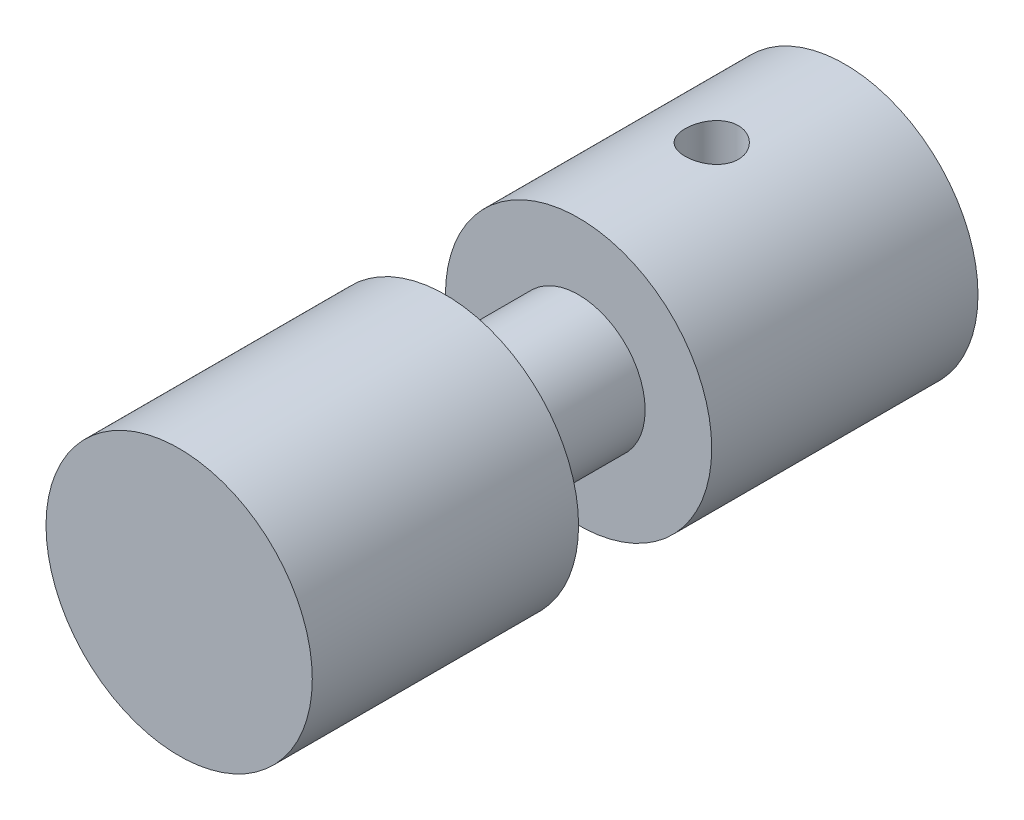
ISO-10303-21;
HEADER;
FILE_DESCRIPTION(('STEP AP214'),'2;1');
FILE_NAME('part.step','',(''),(''),'','','');
FILE_SCHEMA(('AUTOMOTIVE_DESIGN { 1 0 10303 214 1 1 1 1 }'));
ENDSEC;
DATA;
#1=APPLICATION_CONTEXT('core data for automotive mechanical design processes');
#2=APPLICATION_PROTOCOL_DEFINITION('international standard','automotive_design',2000,#1);
#3=PRODUCT_CONTEXT('',#1,'mechanical');
#4=PRODUCT('Part','Part','',(#3));
#5=PRODUCT_RELATED_PRODUCT_CATEGORY('part','',(#4));
#6=PRODUCT_DEFINITION_FORMATION('','',#4);
#7=PRODUCT_DEFINITION_CONTEXT('part definition',#1,'design');
#8=PRODUCT_DEFINITION('design','',#6,#7);
#9=PRODUCT_DEFINITION_SHAPE('','',#8);
#10=(LENGTH_UNIT() NAMED_UNIT(*) SI_UNIT(.MILLI.,.METRE.));
#11=(NAMED_UNIT(*) PLANE_ANGLE_UNIT() SI_UNIT($,.RADIAN.));
#12=(NAMED_UNIT(*) SI_UNIT($,.STERADIAN.) SOLID_ANGLE_UNIT());
#13=UNCERTAINTY_MEASURE_WITH_UNIT(LENGTH_MEASURE(1.E-05),#10,'distance_accuracy_value','');
#14=(GEOMETRIC_REPRESENTATION_CONTEXT(3) GLOBAL_UNCERTAINTY_ASSIGNED_CONTEXT((#13)) GLOBAL_UNIT_ASSIGNED_CONTEXT((#10,
#11,#12)) REPRESENTATION_CONTEXT('',''));
#15=CARTESIAN_POINT('',(0.,0.,0.));
#16=DIRECTION('',(0.,0.,1.));
#17=DIRECTION('',(1.,0.,0.));
#18=AXIS2_PLACEMENT_3D('',#15,#16,#17);
#19=CARTESIAN_POINT('',(0.,0.,10.));
#20=DIRECTION('',(0.,0.,-1.));
#21=DIRECTION('',(-1.,0.,0.));
#22=AXIS2_PLACEMENT_3D('',#19,#20,#21);
#23=CYLINDRICAL_SURFACE('',#22,5.);
#24=CARTESIAN_POINT('',(0.,-5.,6.));
#25=CARTESIAN_POINT('',(0.0555769067926331,-4.99999897580871,5.99999795550166));
#26=CARTESIAN_POINT('',(0.111179660201522,-4.99906385178231,5.99535115703235));
#27=CARTESIAN_POINT('',(0.220813507689019,-4.99542365623231,5.97690149988475));
#28=CARTESIAN_POINT('',(0.274843317541356,-4.99271717860186,5.96309136719849));
#29=CARTESIAN_POINT('',(0.379730305263313,-4.98583649278287,5.92675872637921));
#30=CARTESIAN_POINT('',(0.430590467933134,-4.98166369076718,5.90424456315531));
#31=CARTESIAN_POINT('',(0.527807988864225,-4.97230398035314,5.85116775248871));
#32=CARTESIAN_POINT('',(0.574165615075812,-4.96711713235707,5.8206055843928));
#33=CARTESIAN_POINT('',(0.661693477314865,-4.9562216532997,5.75186150570857));
#34=CARTESIAN_POINT('',(0.702793951158524,-4.95050745504347,5.7135916446088));
#35=CARTESIAN_POINT('',(0.778036756608028,-4.93924180452588,5.6307075836083));
#36=CARTESIAN_POINT('',(0.812178544770424,-4.93369036500424,5.58609288866488));
#37=CARTESIAN_POINT('',(0.87283175334762,-4.92332441812615,5.49128380698813));
#38=CARTESIAN_POINT('',(0.899270938865866,-4.91851707364946,5.44104235620364));
#39=CARTESIAN_POINT('',(0.943305666580308,-4.91026268058418,5.33671818099592));
#40=CARTESIAN_POINT('',(0.960902082437238,-4.90681549761962,5.28263583665366));
#41=CARTESIAN_POINT('',(0.986525299884827,-4.90172805252204,5.17291563609208));
#42=CARTESIAN_POINT('',(0.994674497958777,-4.90006470107188,5.11730745585777));
#43=CARTESIAN_POINT('',(1.00155212772612,-4.89866375060627,5.00549017863566));
#44=CARTESIAN_POINT('',(1.0002815227135,-4.89892595467841,4.94928114367985));
#45=CARTESIAN_POINT('',(0.988454573101819,-4.90132551148185,4.838753211979));
#46=CARTESIAN_POINT('',(0.978038540243905,-4.90343452858763,4.78441859437269));
#47=CARTESIAN_POINT('',(0.94843788462305,-4.90924546160001,4.678283923337));
#48=CARTESIAN_POINT('',(0.929252843100681,-4.91294745357779,4.62648399108099));
#49=CARTESIAN_POINT('',(0.88252478367472,-4.92155618500408,4.5264847382964));
#50=CARTESIAN_POINT('',(0.854926151232114,-4.92647089813704,4.47831212043083));
#51=CARTESIAN_POINT('',(0.792193574572679,-4.93694618773062,4.38722915002719));
#52=CARTESIAN_POINT('',(0.757058764356829,-4.94250683838366,4.34431940314884));
#53=CARTESIAN_POINT('',(0.679499934560584,-4.95377021241462,4.26417059754306));
#54=CARTESIAN_POINT('',(0.636956161212445,-4.95947369210905,4.22704743214087));
#55=CARTESIAN_POINT('',(0.54618502406201,-4.97028848714408,4.16044615369878));
#56=CARTESIAN_POINT('',(0.497957587379389,-4.97539979488974,4.13096813870642));
#57=CARTESIAN_POINT('',(0.397059386878921,-4.98446690160887,4.08047249077402));
#58=CARTESIAN_POINT('',(0.3443818195853,-4.98842088848272,4.05946810635546));
#59=CARTESIAN_POINT('',(0.236148976448665,-4.99471408987858,4.02663952596143));
#60=CARTESIAN_POINT('',(0.18059405007245,-4.99705350000531,4.01481421792637));
#61=CARTESIAN_POINT('',(0.0691794056271508,-4.99982671866868,4.00084354620572));
#62=CARTESIAN_POINT('',(0.0133403283255765,-5.0002917465247,3.99853958045973));
#63=CARTESIAN_POINT('',(-0.0979249341927137,-4.99935051930103,4.00324985894218));
#64=CARTESIAN_POINT('',(-0.153351142443793,-4.99794436941446,4.0102635793526));
#65=CARTESIAN_POINT('',(-0.26170565994654,-4.99343832008018,4.03327837354396));
#66=CARTESIAN_POINT('',(-0.314651948339903,-4.99035376404206,4.0491980684979));
#67=CARTESIAN_POINT('',(-0.417123627499667,-4.98283552061033,4.08948398265581));
#68=CARTESIAN_POINT('',(-0.466648761637539,-4.97840173214227,4.11385083467683));
#69=CARTESIAN_POINT('',(-0.561541173686218,-4.96859911533294,4.17068249065131));
#70=CARTESIAN_POINT('',(-0.606850126752188,-4.96321950437052,4.20324278103895));
#71=CARTESIAN_POINT('',(-0.691418019119207,-4.95214734829882,4.27540919120728));
#72=CARTESIAN_POINT('',(-0.730676308930762,-4.94645476968388,4.31501606639987));
#73=CARTESIAN_POINT('',(-0.802640590774176,-4.93529303556965,4.40087335189112));
#74=CARTESIAN_POINT('',(-0.835237702448655,-4.92982860233304,4.44721574422134));
#75=CARTESIAN_POINT('',(-0.892185420051205,-4.91984191796194,4.54481136135668));
#76=CARTESIAN_POINT('',(-0.916536355922902,-4.91531962913342,4.59606438957355));
#77=CARTESIAN_POINT('',(-0.95615184158196,-4.90776740584383,4.70176824614955));
#78=CARTESIAN_POINT('',(-0.971463499791051,-4.90472974872187,4.75620084121032));
#79=CARTESIAN_POINT('',(-0.992708651627196,-4.90047436792025,4.8669334534909));
#80=CARTESIAN_POINT('',(-0.998643368225112,-4.89925640691111,4.92323322620935));
#81=CARTESIAN_POINT('',(-1.00092091086747,-4.89879149631379,5.03500886454432));
#82=CARTESIAN_POINT('',(-0.997435788070896,-4.89950919189301,5.09048114892701));
#83=CARTESIAN_POINT('',(-0.981352304100061,-4.90275573484614,5.20003164990503));
#84=CARTESIAN_POINT('',(-0.968754016129298,-4.90528456767169,5.2541098776948));
#85=CARTESIAN_POINT('',(-0.934878568498954,-4.91185264219159,5.35922771124055));
#86=CARTESIAN_POINT('',(-0.913622506717345,-4.91588821018831,5.41027436050242));
#87=CARTESIAN_POINT('',(-0.863054644601604,-4.9250171497417,5.50810372073444));
#88=CARTESIAN_POINT('',(-0.833742168774882,-4.93011060998894,5.55488607372514));
#89=CARTESIAN_POINT('',(-0.767305914786414,-4.94088960523225,5.64371557215031));
#90=CARTESIAN_POINT('',(-0.730057887235181,-4.94658372909699,5.6856687652676));
#91=CARTESIAN_POINT('',(-0.649064369013141,-4.95786081871955,5.76278620552917));
#92=CARTESIAN_POINT('',(-0.605317387153335,-4.96344375863184,5.79794889031727));
#93=CARTESIAN_POINT('',(-0.512017629088246,-4.97393832387971,5.86083464394645));
#94=CARTESIAN_POINT('',(-0.462408884429834,-4.97884231219246,5.88847600328002));
#95=CARTESIAN_POINT('',(-0.359166360940732,-4.98735125085,5.93498612259659));
#96=CARTESIAN_POINT('',(-0.305536260863126,-4.99095737138616,5.95386278953249));
#97=CARTESIAN_POINT('',(-0.209821488923779,-4.99576372595371,5.97865194804472));
#98=CARTESIAN_POINT('',(-0.168281664013784,-4.99734303158452,5.98664319370776));
#99=CARTESIAN_POINT('',(-0.0844995252100669,-4.99946154139893,5.99731791235836));
#100=CARTESIAN_POINT('',(-0.042257233748619,-5.00000077873155,6.00000155450977));
#101=CARTESIAN_POINT('',(0.,-5.,6.));
#102=B_SPLINE_CURVE_WITH_KNOTS('',3,(#24,#25,#26,#27,#28,#29,#30,#31,#32,#33,#34,#35,#36,#37,
#38,#39,#40,#41,#42,#43,#44,#45,#46,#47,#48,#49,#50,#51,#52,#53,#54,#55,#56,#57,#58,#59,#60,#61,
#62,#63,#64,#65,#66,#67,#68,#69,#70,#71,#72,#73,#74,#75,#76,#77,#78,#79,#80,#81,#82,#83,#84,#85,
#86,#87,#88,#89,#90,#91,#92,#93,#94,#95,#96,#97,#98,#99,#100,#101),.UNSPECIFIED.,.T.,.F.,(4,2,2,
2,2,2,2,2,2,2,2,2,2,2,2,2,2,2,2,2,2,2,2,2,2,2,2,2,2,2,2,2,2,2,2,2,2,2,4),(0.,0.166576130661258,
0.333284650691323,0.499833735250341,0.666372902230863,0.834932670112185,1.00350559674737,
1.17361195005923,1.34370149365197,1.51156185103587,1.67940504281225,1.84471727006278,
2.0100373925373,2.17647490203593,2.3429315474967,2.51238252491351,2.6818356753982,
2.85155274854024,3.02124925698036,3.18810735676265,3.35495607657868,3.52030453950723,
3.68566539216022,3.85305066033359,4.0204538834593,4.19040628579226,4.36035188723466,
4.52940381032723,4.69843368330415,4.86439722567701,5.03035943492608,5.1959196125311,
5.36149367581867,5.52988076239143,5.69830654532931,5.86849496675637,6.03852955517519,
6.16518775289894,6.29184191370996),.UNSPECIFIED.);
#103=CARTESIAN_POINT('',(0.,-5.,6.));
#104=VERTEX_POINT('',#103);
#105=EDGE_CURVE('E81',#104,#104,#102,.T.);
#106=ORIENTED_EDGE('',*,*,#105,.T.);
#107=EDGE_LOOP('',(#106));
#108=FACE_BOUND('',#107,.T.);
#109=CARTESIAN_POINT('',(0.,5.,6.));
#110=CARTESIAN_POINT('',(-0.0555769067926331,4.99999897580871,5.99999795550166));
#111=CARTESIAN_POINT('',(-0.111179660201522,4.99906385178231,5.99535115703235));
#112=CARTESIAN_POINT('',(-0.220813507689019,4.99542365623231,5.97690149988475));
#113=CARTESIAN_POINT('',(-0.274843317541356,4.99271717860186,5.96309136719849));
#114=CARTESIAN_POINT('',(-0.379730305263313,4.98583649278287,5.92675872637921));
#115=CARTESIAN_POINT('',(-0.430590467933134,4.98166369076718,5.90424456315531));
#116=CARTESIAN_POINT('',(-0.527807988864225,4.97230398035314,5.85116775248871));
#117=CARTESIAN_POINT('',(-0.574165615075812,4.96711713235707,5.8206055843928));
#118=CARTESIAN_POINT('',(-0.661693477314865,4.9562216532997,5.75186150570857));
#119=CARTESIAN_POINT('',(-0.702793951158524,4.95050745504347,5.7135916446088));
#120=CARTESIAN_POINT('',(-0.778036756608028,4.93924180452588,5.6307075836083));
#121=CARTESIAN_POINT('',(-0.812178544770424,4.93369036500424,5.58609288866488));
#122=CARTESIAN_POINT('',(-0.87283175334762,4.92332441812615,5.49128380698813));
#123=CARTESIAN_POINT('',(-0.899270938865866,4.91851707364946,5.44104235620364));
#124=CARTESIAN_POINT('',(-0.943305666580308,4.91026268058418,5.33671818099592));
#125=CARTESIAN_POINT('',(-0.960902082437238,4.90681549761962,5.28263583665366));
#126=CARTESIAN_POINT('',(-0.986525299884827,4.90172805252204,5.17291563609208));
#127=CARTESIAN_POINT('',(-0.994674497958777,4.90006470107188,5.11730745585777));
#128=CARTESIAN_POINT('',(-1.00155212772612,4.89866375060627,5.00549017863566));
#129=CARTESIAN_POINT('',(-1.0002815227135,4.89892595467841,4.94928114367985));
#130=CARTESIAN_POINT('',(-0.988454573101819,4.90132551148185,4.838753211979));
#131=CARTESIAN_POINT('',(-0.978038540243905,4.90343452858763,4.78441859437269));
#132=CARTESIAN_POINT('',(-0.94843788462305,4.90924546160001,4.678283923337));
#133=CARTESIAN_POINT('',(-0.929252843100681,4.91294745357779,4.62648399108099));
#134=CARTESIAN_POINT('',(-0.88252478367472,4.92155618500408,4.5264847382964));
#135=CARTESIAN_POINT('',(-0.854926151232114,4.92647089813704,4.47831212043083));
#136=CARTESIAN_POINT('',(-0.792193574572679,4.93694618773062,4.38722915002719));
#137=CARTESIAN_POINT('',(-0.757058764356829,4.94250683838366,4.34431940314884));
#138=CARTESIAN_POINT('',(-0.679499934560584,4.95377021241462,4.26417059754306));
#139=CARTESIAN_POINT('',(-0.636956161212445,4.95947369210905,4.22704743214087));
#140=CARTESIAN_POINT('',(-0.54618502406201,4.97028848714408,4.16044615369878));
#141=CARTESIAN_POINT('',(-0.497957587379389,4.97539979488974,4.13096813870642));
#142=CARTESIAN_POINT('',(-0.397059386878921,4.98446690160887,4.08047249077402));
#143=CARTESIAN_POINT('',(-0.3443818195853,4.98842088848272,4.05946810635546));
#144=CARTESIAN_POINT('',(-0.236148976448665,4.99471408987858,4.02663952596143));
#145=CARTESIAN_POINT('',(-0.18059405007245,4.99705350000531,4.01481421792637));
#146=CARTESIAN_POINT('',(-0.0691794056271508,4.99982671866868,4.00084354620572));
#147=CARTESIAN_POINT('',(-0.0133403283255765,5.0002917465247,3.99853958045973));
#148=CARTESIAN_POINT('',(0.0979249341927137,4.99935051930103,4.00324985894218));
#149=CARTESIAN_POINT('',(0.153351142443793,4.99794436941446,4.0102635793526));
#150=CARTESIAN_POINT('',(0.26170565994654,4.99343832008018,4.03327837354396));
#151=CARTESIAN_POINT('',(0.314651948339903,4.99035376404206,4.0491980684979));
#152=CARTESIAN_POINT('',(0.417123627499667,4.98283552061033,4.08948398265581));
#153=CARTESIAN_POINT('',(0.466648761637539,4.97840173214227,4.11385083467683));
#154=CARTESIAN_POINT('',(0.561541173686218,4.96859911533294,4.17068249065131));
#155=CARTESIAN_POINT('',(0.606850126752188,4.96321950437052,4.20324278103895));
#156=CARTESIAN_POINT('',(0.691418019119207,4.95214734829882,4.27540919120728));
#157=CARTESIAN_POINT('',(0.730676308930762,4.94645476968388,4.31501606639987));
#158=CARTESIAN_POINT('',(0.802640590774176,4.93529303556965,4.40087335189112));
#159=CARTESIAN_POINT('',(0.835237702448655,4.92982860233304,4.44721574422134));
#160=CARTESIAN_POINT('',(0.892185420051205,4.91984191796194,4.54481136135668));
#161=CARTESIAN_POINT('',(0.916536355922902,4.91531962913342,4.59606438957355));
#162=CARTESIAN_POINT('',(0.95615184158196,4.90776740584383,4.70176824614955));
#163=CARTESIAN_POINT('',(0.971463499791051,4.90472974872187,4.75620084121032));
#164=CARTESIAN_POINT('',(0.992708651627196,4.90047436792025,4.8669334534909));
#165=CARTESIAN_POINT('',(0.998643368225112,4.89925640691111,4.92323322620935));
#166=CARTESIAN_POINT('',(1.00092091086747,4.89879149631379,5.03500886454432));
#167=CARTESIAN_POINT('',(0.997435788070896,4.89950919189301,5.09048114892701));
#168=CARTESIAN_POINT('',(0.981352304100061,4.90275573484614,5.20003164990503));
#169=CARTESIAN_POINT('',(0.968754016129298,4.90528456767169,5.2541098776948));
#170=CARTESIAN_POINT('',(0.934878568498954,4.91185264219159,5.35922771124055));
#171=CARTESIAN_POINT('',(0.913622506717345,4.91588821018831,5.41027436050242));
#172=CARTESIAN_POINT('',(0.863054644601604,4.9250171497417,5.50810372073444));
#173=CARTESIAN_POINT('',(0.833742168774882,4.93011060998894,5.55488607372514));
#174=CARTESIAN_POINT('',(0.767305914786414,4.94088960523225,5.64371557215031));
#175=CARTESIAN_POINT('',(0.730057887235181,4.94658372909699,5.6856687652676));
#176=CARTESIAN_POINT('',(0.649064369013141,4.95786081871955,5.76278620552917));
#177=CARTESIAN_POINT('',(0.605317387153335,4.96344375863184,5.79794889031727));
#178=CARTESIAN_POINT('',(0.512017629088246,4.97393832387971,5.86083464394645));
#179=CARTESIAN_POINT('',(0.462408884429834,4.97884231219246,5.88847600328002));
#180=CARTESIAN_POINT('',(0.359166360940732,4.98735125085,5.93498612259659));
#181=CARTESIAN_POINT('',(0.305536260863126,4.99095737138616,5.95386278953249));
#182=CARTESIAN_POINT('',(0.209821488923779,4.99576372595371,5.97865194804472));
#183=CARTESIAN_POINT('',(0.168281664013784,4.99734303158452,5.98664319370776));
#184=CARTESIAN_POINT('',(0.0844995252100669,4.99946154139893,5.99731791235836));
#185=CARTESIAN_POINT('',(0.042257233748619,5.00000077873155,6.00000155450977));
#186=CARTESIAN_POINT('',(0.,5.,6.));
#187=B_SPLINE_CURVE_WITH_KNOTS('',3,(#109,#110,#111,#112,#113,#114,#115,#116,#117,#118,#119,
#120,#121,#122,#123,#124,#125,#126,#127,#128,#129,#130,#131,#132,#133,#134,#135,#136,#137,#138,
#139,#140,#141,#142,#143,#144,#145,#146,#147,#148,#149,#150,#151,#152,#153,#154,#155,#156,#157,
#158,#159,#160,#161,#162,#163,#164,#165,#166,#167,#168,#169,#170,#171,#172,#173,#174,#175,#176,
#177,#178,#179,#180,#181,#182,#183,#184,#185,#186),.UNSPECIFIED.,.T.,.F.,(4,2,2,2,2,2,2,2,2,2,2,
2,2,2,2,2,2,2,2,2,2,2,2,2,2,2,2,2,2,2,2,2,2,2,2,2,2,2,4),(0.,0.166576130661258,
0.333284650691323,0.499833735250341,0.666372902230863,0.834932670112185,1.00350559674737,
1.17361195005923,1.34370149365197,1.51156185103587,1.67940504281225,1.84471727006278,
2.0100373925373,2.17647490203593,2.3429315474967,2.51238252491351,2.6818356753982,
2.85155274854024,3.02124925698036,3.18810735676265,3.35495607657868,3.52030453950723,
3.68566539216022,3.85305066033359,4.0204538834593,4.19040628579226,4.36035188723466,
4.52940381032723,4.69843368330415,4.86439722567701,5.03035943492608,5.1959196125311,
5.36149367581867,5.52988076239143,5.69830654532931,5.86849496675637,6.03852955517519,
6.16518775289894,6.29184191370996),.UNSPECIFIED.);
#188=CARTESIAN_POINT('',(0.,5.,6.));
#189=VERTEX_POINT('',#188);
#190=EDGE_CURVE('E76',#189,#189,#187,.T.);
#191=ORIENTED_EDGE('',*,*,#190,.T.);
#192=EDGE_LOOP('',(#191));
#193=FACE_BOUND('',#192,.T.);
#194=CARTESIAN_POINT('',(0.,0.,10.));
#195=DIRECTION('',(0.,0.,1.));
#196=DIRECTION('',(1.,0.,0.));
#197=AXIS2_PLACEMENT_3D('',#194,#195,#196);
#198=CIRCLE('',#197,5.);
#199=CARTESIAN_POINT('',(5.,0.,10.));
#200=VERTEX_POINT('',#199);
#201=EDGE_CURVE('E44',#200,#200,#198,.T.);
#202=ORIENTED_EDGE('',*,*,#201,.F.);
#203=EDGE_LOOP('',(#202));
#204=FACE_BOUND('',#203,.T.);
#205=CARTESIAN_POINT('',(0.,0.,0.));
#206=DIRECTION('',(0.,0.,1.));
#207=DIRECTION('',(1.,0.,0.));
#208=AXIS2_PLACEMENT_3D('',#205,#206,#207);
#209=CIRCLE('',#208,5.);
#210=CARTESIAN_POINT('',(5.,0.,0.));
#211=VERTEX_POINT('',#210);
#212=EDGE_CURVE('E49',#211,#211,#209,.T.);
#213=ORIENTED_EDGE('',*,*,#212,.T.);
#214=EDGE_LOOP('',(#213));
#215=FACE_BOUND('',#214,.T.);
#216=ADVANCED_FACE('F31',(#108,#193,#204,#215),#23,.T.);
#217=CARTESIAN_POINT('',(0.,0.,10.));
#218=DIRECTION('',(0.,0.,1.));
#219=DIRECTION('',(1.,0.,0.));
#220=AXIS2_PLACEMENT_3D('',#217,#218,#219);
#221=PLANE('',#220);
#222=CARTESIAN_POINT('',(0.,0.,10.));
#223=DIRECTION('',(0.,0.,1.));
#224=DIRECTION('',(1.,0.,0.));
#225=AXIS2_PLACEMENT_3D('',#222,#223,#224);
#226=CIRCLE('',#225,2.5);
#227=CARTESIAN_POINT('',(2.5,0.,10.));
#228=VERTEX_POINT('',#227);
#229=EDGE_CURVE('E10',#228,#228,#226,.T.);
#230=ORIENTED_EDGE('',*,*,#229,.F.);
#231=EDGE_LOOP('',(#230));
#232=FACE_BOUND('',#231,.T.);
#233=ORIENTED_EDGE('',*,*,#201,.T.);
#234=EDGE_LOOP('',(#233));
#235=FACE_BOUND('',#234,.T.);
#236=ADVANCED_FACE('F115',(#232,#235),#221,.T.);
#237=CARTESIAN_POINT('',(0.,0.,0.));
#238=DIRECTION('',(0.,0.,1.));
#239=DIRECTION('',(1.,0.,0.));
#240=AXIS2_PLACEMENT_3D('',#237,#238,#239);
#241=PLANE('',#240);
#242=CARTESIAN_POINT('',(0.,0.,0.));
#243=DIRECTION('',(0.,0.,-1.));
#244=DIRECTION('',(-1.,0.,0.));
#245=AXIS2_PLACEMENT_3D('',#242,#243,#244);
#246=CIRCLE('',#245,1.5);
#247=CARTESIAN_POINT('',(-1.5,0.,0.));
#248=VERTEX_POINT('',#247);
#249=EDGE_CURVE('E87',#248,#248,#246,.T.);
#250=ORIENTED_EDGE('',*,*,#249,.F.);
#251=EDGE_LOOP('',(#250));
#252=FACE_BOUND('',#251,.T.);
#253=ORIENTED_EDGE('',*,*,#212,.F.);
#254=EDGE_LOOP('',(#253));
#255=FACE_BOUND('',#254,.T.);
#256=ADVANCED_FACE('F122',(#252,#255),#241,.F.);
#257=CARTESIAN_POINT('',(0.,0.,15.));
#258=DIRECTION('',(0.,0.,-1.));
#259=DIRECTION('',(-1.,0.,0.));
#260=AXIS2_PLACEMENT_3D('',#257,#258,#259);
#261=CYLINDRICAL_SURFACE('',#260,2.5);
#262=CARTESIAN_POINT('',(0.,0.,15.));
#263=DIRECTION('',(0.,0.,1.));
#264=DIRECTION('',(1.,0.,0.));
#265=AXIS2_PLACEMENT_3D('',#262,#263,#264);
#266=CIRCLE('',#265,2.5);
#267=CARTESIAN_POINT('',(2.5,0.,15.));
#268=VERTEX_POINT('',#267);
#269=EDGE_CURVE('E52',#268,#268,#266,.T.);
#270=ORIENTED_EDGE('',*,*,#269,.F.);
#271=EDGE_LOOP('',(#270));
#272=FACE_BOUND('',#271,.T.);
#273=ORIENTED_EDGE('',*,*,#229,.T.);
#274=EDGE_LOOP('',(#273));
#275=FACE_BOUND('',#274,.T.);
#276=ADVANCED_FACE('F134',(#272,#275),#261,.T.);
#277=CARTESIAN_POINT('',(0.,0.,25.));
#278=DIRECTION('',(0.,0.,-1.));
#279=DIRECTION('',(-1.,0.,0.));
#280=AXIS2_PLACEMENT_3D('',#277,#278,#279);
#281=CYLINDRICAL_SURFACE('',#280,5.);
#282=CARTESIAN_POINT('',(0.,0.,25.));
#283=DIRECTION('',(0.,0.,1.));
#284=DIRECTION('',(1.,0.,0.));
#285=AXIS2_PLACEMENT_3D('',#282,#283,#284);
#286=CIRCLE('',#285,5.);
#287=CARTESIAN_POINT('',(5.,0.,25.));
#288=VERTEX_POINT('',#287);
#289=EDGE_CURVE('E94',#288,#288,#286,.T.);
#290=ORIENTED_EDGE('',*,*,#289,.F.);
#291=EDGE_LOOP('',(#290));
#292=FACE_BOUND('',#291,.T.);
#293=CARTESIAN_POINT('',(0.,0.,15.));
#294=DIRECTION('',(0.,0.,1.));
#295=DIRECTION('',(1.,0.,0.));
#296=AXIS2_PLACEMENT_3D('',#293,#294,#295);
#297=CIRCLE('',#296,5.);
#298=CARTESIAN_POINT('',(5.,0.,15.));
#299=VERTEX_POINT('',#298);
#300=EDGE_CURVE('E91',#299,#299,#297,.T.);
#301=ORIENTED_EDGE('',*,*,#300,.T.);
#302=EDGE_LOOP('',(#301));
#303=FACE_BOUND('',#302,.T.);
#304=ADVANCED_FACE('F99',(#292,#303),#281,.T.);
#305=CARTESIAN_POINT('',(0.,0.,25.));
#306=DIRECTION('',(0.,0.,1.));
#307=DIRECTION('',(1.,0.,0.));
#308=AXIS2_PLACEMENT_3D('',#305,#306,#307);
#309=PLANE('',#308);
#310=ORIENTED_EDGE('',*,*,#289,.T.);
#311=EDGE_LOOP('',(#310));
#312=FACE_BOUND('',#311,.T.);
#313=ADVANCED_FACE('F103',(#312),#309,.T.);
#314=CARTESIAN_POINT('',(0.,0.,15.));
#315=DIRECTION('',(0.,0.,1.));
#316=DIRECTION('',(1.,0.,0.));
#317=AXIS2_PLACEMENT_3D('',#314,#315,#316);
#318=PLANE('',#317);
#319=ORIENTED_EDGE('',*,*,#269,.T.);
#320=EDGE_LOOP('',(#319));
#321=FACE_BOUND('',#320,.T.);
#322=ORIENTED_EDGE('',*,*,#300,.F.);
#323=EDGE_LOOP('',(#322));
#324=FACE_BOUND('',#323,.T.);
#325=ADVANCED_FACE('F101',(#321,#324),#318,.F.);
#326=CARTESIAN_POINT('',(0.,0.,10.));
#327=DIRECTION('',(0.,0.,-1.));
#328=DIRECTION('',(-1.,0.,0.));
#329=AXIS2_PLACEMENT_3D('',#326,#327,#328);
#330=CYLINDRICAL_SURFACE('',#329,1.5);
#331=CARTESIAN_POINT('',(0.,-1.5,6.));
#332=CARTESIAN_POINT('',(-0.0502423583340641,-1.50000020822414,6.00000027481625));
#333=CARTESIAN_POINT('',(-0.100484543566458,-1.49745401376693,5.99619301502225));
#334=CARTESIAN_POINT('',(-0.199366529015834,-1.48752326211906,5.98120156794717));
#335=CARTESIAN_POINT('',(-0.248005556977502,-1.48013640790618,5.97001387843835));
#336=CARTESIAN_POINT('',(-0.342106153927126,-1.46125241202354,5.94094614133758));
#337=CARTESIAN_POINT('',(-0.387581436328778,-1.44977452746657,5.92309742999603));
#338=CARTESIAN_POINT('',(-0.474707645498629,-1.4236306893872,5.88146831836425));
#339=CARTESIAN_POINT('',(-0.516358015804834,-1.40896427302755,5.85768705684972));
#340=CARTESIAN_POINT('',(-0.598642350385055,-1.37613664684919,5.80267153131629));
#341=CARTESIAN_POINT('',(-0.638890152730338,-1.3577844878966,5.77097606962855));
#342=CARTESIAN_POINT('',(-0.713864022346369,-1.31991156541733,5.70213497567078));
#343=CARTESIAN_POINT('',(-0.748582027719439,-1.30038915178416,5.66498153508113));
#344=CARTESIAN_POINT('',(-0.81711148872748,-1.25864132339397,5.57947381619366));
#345=CARTESIAN_POINT('',(-0.849915931813755,-1.23647533968899,5.53027717339828));
#346=CARTESIAN_POINT('',(-0.906751785070868,-1.19542073676408,5.42581831117673));
#347=CARTESIAN_POINT('',(-0.930798367132494,-1.17652647977327,5.37056679921861));
#348=CARTESIAN_POINT('',(-0.963370175057203,-1.14988133320735,5.2716443532892));
#349=CARTESIAN_POINT('',(-0.974372236180082,-1.14048813946218,5.22923577356309));
#350=CARTESIAN_POINT('',(-0.9907530889261,-1.12628984829786,5.14262774762913));
#351=CARTESIAN_POINT('',(-0.996141573259661,-1.12147684372013,5.09843152563681));
#352=CARTESIAN_POINT('',(-1.00095682070629,-1.11718302804083,5.00926261057193));
#353=CARTESIAN_POINT('',(-1.0003592145882,-1.11772401279478,4.9642874882744));
#354=CARTESIAN_POINT('',(-0.993187906666195,-1.12409887741485,4.87518251324952));
#355=CARTESIAN_POINT('',(-0.986609141899784,-1.12993724142592,4.83105340898368));
#356=CARTESIAN_POINT('',(-0.968324971088712,-1.14563592995791,4.74676647438121));
#357=CARTESIAN_POINT('',(-0.956858557405003,-1.15530744165153,4.70651933203847));
#358=CARTESIAN_POINT('',(-0.929350592909501,-1.17754811463845,4.62848815450425));
#359=CARTESIAN_POINT('',(-0.913307536614354,-1.19011822916388,4.59070493485137));
#360=CARTESIAN_POINT('',(-0.873369093698318,-1.21982098202212,4.51048730235886));
#361=CARTESIAN_POINT('',(-0.848540261643841,-1.23736158924507,4.46867004990594));
#362=CARTESIAN_POINT('',(-0.793344802336528,-1.27345768922483,4.38930830250809));
#363=CARTESIAN_POINT('',(-0.762971345040337,-1.29201441370947,4.35176917116287));
#364=CARTESIAN_POINT('',(-0.689905826559709,-1.33271671862096,4.27372872714443));
#365=CARTESIAN_POINT('',(-0.645969691404497,-1.35477372355024,4.2343329756443));
#366=CARTESIAN_POINT('',(-0.551003999553808,-1.39609050337857,4.16340175274506));
#367=CARTESIAN_POINT('',(-0.499981149675162,-1.41535288825285,4.13185892729895));
#368=CARTESIAN_POINT('',(-0.402428913545599,-1.44572702044166,4.0832611406858));
#369=CARTESIAN_POINT('',(-0.356978821685239,-1.45769630582498,4.06457831832979));
#370=CARTESIAN_POINT('',(-0.263018021968452,-1.47753859515521,4.03394753718806));
#371=CARTESIAN_POINT('',(-0.214509939501016,-1.48541506063844,4.02199388643409));
#372=CARTESIAN_POINT('',(-0.115492726585946,-1.49637941078331,4.0054194173808));
#373=CARTESIAN_POINT('',(-0.0649759059670219,-1.49944661230576,4.00083026953082));
#374=CARTESIAN_POINT('',(0.0362207596946185,-1.50041557482591,3.99937645571895));
#375=CARTESIAN_POINT('',(0.0869005930932835,-1.49831769692815,4.00251124975561));
#376=CARTESIAN_POINT('',(0.183227858602148,-1.48949794712138,4.01581202778098));
#377=CARTESIAN_POINT('',(0.228978722339657,-1.48311123195135,4.02546864887766));
#378=CARTESIAN_POINT('',(0.318058196213641,-1.46659224642396,4.05079784300638));
#379=CARTESIAN_POINT('',(0.361386418785356,-1.45645937873408,4.0664713754639));
#380=CARTESIAN_POINT('',(0.447332375233223,-1.4324817626467,4.10432614852268));
#381=CARTESIAN_POINT('',(0.489748092316565,-1.41844935068245,4.12684407704176));
#382=CARTESIAN_POINT('',(0.570341511977791,-1.38800927805403,4.1772166449723));
#383=CARTESIAN_POINT('',(0.608516574097256,-1.37160015200651,4.20507458026296));
#384=CARTESIAN_POINT('',(0.685927227415324,-1.33477273328242,4.27030393408237));
#385=CARTESIAN_POINT('',(0.724375937862666,-1.31413078406203,4.30848313005202));
#386=CARTESIAN_POINT('',(0.794669840332394,-1.27285586536854,4.39055571496407));
#387=CARTESIAN_POINT('',(0.826510468230435,-1.25222291185946,4.4344530194994));
#388=CARTESIAN_POINT('',(0.880623882794765,-1.21469839506517,4.5235712064292));
#389=CARTESIAN_POINT('',(0.903478180804395,-1.19763798588661,4.56836601689986));
#390=CARTESIAN_POINT('',(0.942481068876252,-1.16719487207113,4.66193632639057));
#391=CARTESIAN_POINT('',(0.958641728453859,-1.1538055628277,4.7107044691977));
#392=CARTESIAN_POINT('',(0.981179217293119,-1.13466604076532,4.80228224356705));
#393=CARTESIAN_POINT('',(0.988792987823092,-1.12797499006895,4.84458590492947));
#394=CARTESIAN_POINT('',(0.998496029624888,-1.11939733222928,4.93028664066772));
#395=CARTESIAN_POINT('',(1.00059130142516,-1.11750550674066,4.97368247557324));
#396=CARTESIAN_POINT('',(0.999119609907757,-1.11882100574833,5.06032152835836));
#397=CARTESIAN_POINT('',(0.995549293852656,-1.12203134956834,5.10356464068146));
#398=CARTESIAN_POINT('',(0.982984986109971,-1.1330522619864,5.18867176427149));
#399=CARTESIAN_POINT('',(0.97398375858765,-1.14086896751217,5.23053385693039));
#400=CARTESIAN_POINT('',(0.947965178356308,-1.1626342196827,5.32285559321432));
#401=CARTESIAN_POINT('',(0.929450935941993,-1.17766166854602,5.37263385636953));
#402=CARTESIAN_POINT('',(0.885422631474873,-1.21111080629161,5.46774341708941));
#403=CARTESIAN_POINT('',(0.85989874178542,-1.22953724861883,5.51306834896843));
#404=CARTESIAN_POINT('',(0.801991402694656,-1.26808593269726,5.59964094359684));
#405=CARTESIAN_POINT('',(0.76949154944827,-1.28823293691071,5.64079937271926));
#406=CARTESIAN_POINT('',(0.698358840177308,-1.32814150773993,5.71766123912123));
#407=CARTESIAN_POINT('',(0.65972410513495,-1.3479029541764,5.75336299851241));
#408=CARTESIAN_POINT('',(0.570728664877767,-1.38815775980392,5.82335605215706));
#409=CARTESIAN_POINT('',(0.519480834775985,-1.40834902724558,5.85670932008983));
#410=CARTESIAN_POINT('',(0.410434277887487,-1.44388832937518,5.91395663833199));
#411=CARTESIAN_POINT('',(0.35264603122502,-1.45924396722731,5.93786555341182));
#412=CARTESIAN_POINT('',(0.245717534917523,-1.48050822418367,5.97057728908202));
#413=CARTESIAN_POINT('',(0.197506162628865,-1.48775740184446,5.98155551954934));
#414=CARTESIAN_POINT('',(0.0995290060120643,-1.49750140070948,5.99626401626902));
#415=CARTESIAN_POINT('',(0.0497644180940281,-1.49999979375663,5.999999727798));
#416=CARTESIAN_POINT('',(0.,-1.5,6.));
#417=B_SPLINE_CURVE_WITH_KNOTS('',3,(#331,#332,#333,#334,#335,#336,#337,#338,#339,#340,#341,
#342,#343,#344,#345,#346,#347,#348,#349,#350,#351,#352,#353,#354,#355,#356,#357,#358,#359,#360,
#361,#362,#363,#364,#365,#366,#367,#368,#369,#370,#371,#372,#373,#374,#375,#376,#377,#378,#379,
#380,#381,#382,#383,#384,#385,#386,#387,#388,#389,#390,#391,#392,#393,#394,#395,#396,#397,#398,
#399,#400,#401,#402,#403,#404,#405,#406,#407,#408,#409,#410,#411,#412,#413,#414,#415,#416),
.UNSPECIFIED.,.T.,.F.,(4,2,2,2,2,2,2,2,2,2,2,2,2,2,2,2,2,2,2,2,2,2,2,2,2,2,2,2,2,2,2,2,2,2,2,2,
2,2,2,2,2,2,4),(0.,0.1505266132527,0.301124707174344,0.451023076595116,0.600943219336933,
0.763585145002784,0.926462058021593,1.11503341647991,1.30327652722719,1.43716846838015,
1.57082883922905,1.70503355867689,1.83935198631676,1.96774431099011,2.09617891902539,
2.25073787329797,2.40548851889213,2.5935947724756,2.78152420149865,2.93262043847563,
3.08358867570591,3.23520441646309,3.38680955765891,3.5277654239542,3.66874377568319,
3.81826173413942,3.96787227471786,4.1411408806983,4.31452876587063,4.47324967649701,
4.63168313315306,4.76162024003012,4.8914160016149,5.02128860137218,5.15133461921144,
5.31603304346011,5.48096356682587,5.64889622595852,5.81688041978686,6.00897675773025,
6.20076953274023,6.34997645676983,6.49907115623394),.UNSPECIFIED.);
#418=CARTESIAN_POINT('',(0.,-1.5,6.));
#419=VERTEX_POINT('',#418);
#420=EDGE_CURVE('E35',#419,#419,#417,.T.);
#421=ORIENTED_EDGE('',*,*,#420,.T.);
#422=EDGE_LOOP('',(#421));
#423=FACE_BOUND('',#422,.T.);
#424=CARTESIAN_POINT('',(0.,1.5,6.));
#425=CARTESIAN_POINT('',(0.0502423583340641,1.50000020822414,6.00000027481625));
#426=CARTESIAN_POINT('',(0.100484543566458,1.49745401376693,5.99619301502225));
#427=CARTESIAN_POINT('',(0.199366529015834,1.48752326211906,5.98120156794717));
#428=CARTESIAN_POINT('',(0.248005556977502,1.48013640790618,5.97001387843835));
#429=CARTESIAN_POINT('',(0.342106153927126,1.46125241202354,5.94094614133758));
#430=CARTESIAN_POINT('',(0.387581436328778,1.44977452746657,5.92309742999603));
#431=CARTESIAN_POINT('',(0.474707645498629,1.4236306893872,5.88146831836425));
#432=CARTESIAN_POINT('',(0.516358015804834,1.40896427302755,5.85768705684972));
#433=CARTESIAN_POINT('',(0.598642350385055,1.37613664684919,5.80267153131629));
#434=CARTESIAN_POINT('',(0.638890152730338,1.3577844878966,5.77097606962855));
#435=CARTESIAN_POINT('',(0.713864022346369,1.31991156541733,5.70213497567078));
#436=CARTESIAN_POINT('',(0.748582027719439,1.30038915178416,5.66498153508113));
#437=CARTESIAN_POINT('',(0.81711148872748,1.25864132339397,5.57947381619366));
#438=CARTESIAN_POINT('',(0.849915931813755,1.23647533968899,5.53027717339828));
#439=CARTESIAN_POINT('',(0.906751785070868,1.19542073676408,5.42581831117673));
#440=CARTESIAN_POINT('',(0.930798367132494,1.17652647977327,5.37056679921861));
#441=CARTESIAN_POINT('',(0.963370175057203,1.14988133320735,5.2716443532892));
#442=CARTESIAN_POINT('',(0.974372236180082,1.14048813946218,5.22923577356309));
#443=CARTESIAN_POINT('',(0.9907530889261,1.12628984829786,5.14262774762913));
#444=CARTESIAN_POINT('',(0.996141573259661,1.12147684372013,5.09843152563681));
#445=CARTESIAN_POINT('',(1.00095682070629,1.11718302804083,5.00926261057193));
#446=CARTESIAN_POINT('',(1.0003592145882,1.11772401279478,4.9642874882744));
#447=CARTESIAN_POINT('',(0.993187906666195,1.12409887741485,4.87518251324952));
#448=CARTESIAN_POINT('',(0.986609141899784,1.12993724142592,4.83105340898368));
#449=CARTESIAN_POINT('',(0.968324971088712,1.14563592995791,4.74676647438121));
#450=CARTESIAN_POINT('',(0.956858557405003,1.15530744165153,4.70651933203847));
#451=CARTESIAN_POINT('',(0.929350592909501,1.17754811463845,4.62848815450425));
#452=CARTESIAN_POINT('',(0.913307536614354,1.19011822916388,4.59070493485137));
#453=CARTESIAN_POINT('',(0.873369093698318,1.21982098202212,4.51048730235886));
#454=CARTESIAN_POINT('',(0.848540261643841,1.23736158924507,4.46867004990594));
#455=CARTESIAN_POINT('',(0.793344802336528,1.27345768922483,4.38930830250809));
#456=CARTESIAN_POINT('',(0.762971345040337,1.29201441370947,4.35176917116287));
#457=CARTESIAN_POINT('',(0.689905826559709,1.33271671862096,4.27372872714443));
#458=CARTESIAN_POINT('',(0.645969691404497,1.35477372355024,4.2343329756443));
#459=CARTESIAN_POINT('',(0.551003999553808,1.39609050337857,4.16340175274506));
#460=CARTESIAN_POINT('',(0.499981149675162,1.41535288825285,4.13185892729895));
#461=CARTESIAN_POINT('',(0.402428913545599,1.44572702044166,4.0832611406858));
#462=CARTESIAN_POINT('',(0.356978821685239,1.45769630582498,4.06457831832979));
#463=CARTESIAN_POINT('',(0.263018021968452,1.47753859515521,4.03394753718806));
#464=CARTESIAN_POINT('',(0.214509939501016,1.48541506063844,4.02199388643409));
#465=CARTESIAN_POINT('',(0.115492726585946,1.49637941078331,4.0054194173808));
#466=CARTESIAN_POINT('',(0.0649759059670219,1.49944661230576,4.00083026953082));
#467=CARTESIAN_POINT('',(-0.0362207596946185,1.50041557482591,3.99937645571895));
#468=CARTESIAN_POINT('',(-0.0869005930932835,1.49831769692815,4.00251124975561));
#469=CARTESIAN_POINT('',(-0.183227858602148,1.48949794712138,4.01581202778098));
#470=CARTESIAN_POINT('',(-0.228978722339657,1.48311123195135,4.02546864887766));
#471=CARTESIAN_POINT('',(-0.318058196213641,1.46659224642396,4.05079784300638));
#472=CARTESIAN_POINT('',(-0.361386418785356,1.45645937873408,4.0664713754639));
#473=CARTESIAN_POINT('',(-0.447332375233223,1.4324817626467,4.10432614852268));
#474=CARTESIAN_POINT('',(-0.489748092316565,1.41844935068245,4.12684407704176));
#475=CARTESIAN_POINT('',(-0.570341511977791,1.38800927805403,4.1772166449723));
#476=CARTESIAN_POINT('',(-0.608516574097256,1.37160015200651,4.20507458026296));
#477=CARTESIAN_POINT('',(-0.685927227415324,1.33477273328242,4.27030393408237));
#478=CARTESIAN_POINT('',(-0.724375937862666,1.31413078406203,4.30848313005202));
#479=CARTESIAN_POINT('',(-0.794669840332394,1.27285586536854,4.39055571496407));
#480=CARTESIAN_POINT('',(-0.826510468230435,1.25222291185946,4.4344530194994));
#481=CARTESIAN_POINT('',(-0.880623882794765,1.21469839506517,4.5235712064292));
#482=CARTESIAN_POINT('',(-0.903478180804395,1.19763798588661,4.56836601689986));
#483=CARTESIAN_POINT('',(-0.942481068876252,1.16719487207113,4.66193632639057));
#484=CARTESIAN_POINT('',(-0.958641728453859,1.1538055628277,4.7107044691977));
#485=CARTESIAN_POINT('',(-0.981179217293119,1.13466604076532,4.80228224356705));
#486=CARTESIAN_POINT('',(-0.988792987823092,1.12797499006895,4.84458590492947));
#487=CARTESIAN_POINT('',(-0.998496029624888,1.11939733222928,4.93028664066772));
#488=CARTESIAN_POINT('',(-1.00059130142516,1.11750550674066,4.97368247557324));
#489=CARTESIAN_POINT('',(-0.999119609907757,1.11882100574833,5.06032152835836));
#490=CARTESIAN_POINT('',(-0.995549293852656,1.12203134956834,5.10356464068146));
#491=CARTESIAN_POINT('',(-0.982984986109971,1.1330522619864,5.18867176427149));
#492=CARTESIAN_POINT('',(-0.97398375858765,1.14086896751217,5.23053385693039));
#493=CARTESIAN_POINT('',(-0.947965178356308,1.1626342196827,5.32285559321432));
#494=CARTESIAN_POINT('',(-0.929450935941993,1.17766166854602,5.37263385636953));
#495=CARTESIAN_POINT('',(-0.885422631474873,1.21111080629161,5.46774341708941));
#496=CARTESIAN_POINT('',(-0.85989874178542,1.22953724861883,5.51306834896843));
#497=CARTESIAN_POINT('',(-0.801991402694656,1.26808593269726,5.59964094359684));
#498=CARTESIAN_POINT('',(-0.76949154944827,1.28823293691071,5.64079937271926));
#499=CARTESIAN_POINT('',(-0.698358840177308,1.32814150773993,5.71766123912123));
#500=CARTESIAN_POINT('',(-0.65972410513495,1.3479029541764,5.75336299851241));
#501=CARTESIAN_POINT('',(-0.570728664877767,1.38815775980392,5.82335605215706));
#502=CARTESIAN_POINT('',(-0.519480834775985,1.40834902724558,5.85670932008983));
#503=CARTESIAN_POINT('',(-0.410434277887487,1.44388832937518,5.91395663833199));
#504=CARTESIAN_POINT('',(-0.35264603122502,1.45924396722731,5.93786555341182));
#505=CARTESIAN_POINT('',(-0.245717534917523,1.48050822418367,5.97057728908202));
#506=CARTESIAN_POINT('',(-0.197506162628865,1.48775740184446,5.98155551954934));
#507=CARTESIAN_POINT('',(-0.0995290060120643,1.49750140070948,5.99626401626902));
#508=CARTESIAN_POINT('',(-0.0497644180940281,1.49999979375663,5.999999727798));
#509=CARTESIAN_POINT('',(0.,1.5,6.));
#510=B_SPLINE_CURVE_WITH_KNOTS('',3,(#424,#425,#426,#427,#428,#429,#430,#431,#432,#433,#434,
#435,#436,#437,#438,#439,#440,#441,#442,#443,#444,#445,#446,#447,#448,#449,#450,#451,#452,#453,
#454,#455,#456,#457,#458,#459,#460,#461,#462,#463,#464,#465,#466,#467,#468,#469,#470,#471,#472,
#473,#474,#475,#476,#477,#478,#479,#480,#481,#482,#483,#484,#485,#486,#487,#488,#489,#490,#491,
#492,#493,#494,#495,#496,#497,#498,#499,#500,#501,#502,#503,#504,#505,#506,#507,#508,#509),
.UNSPECIFIED.,.T.,.F.,(4,2,2,2,2,2,2,2,2,2,2,2,2,2,2,2,2,2,2,2,2,2,2,2,2,2,2,2,2,2,2,2,2,2,2,2,
2,2,2,2,2,2,4),(0.,0.1505266132527,0.301124707174344,0.451023076595116,0.600943219336933,
0.763585145002784,0.926462058021593,1.11503341647991,1.30327652722719,1.43716846838015,
1.57082883922905,1.70503355867689,1.83935198631676,1.96774431099011,2.09617891902539,
2.25073787329797,2.40548851889213,2.5935947724756,2.78152420149865,2.93262043847563,
3.08358867570591,3.23520441646309,3.38680955765891,3.5277654239542,3.66874377568319,
3.81826173413942,3.96787227471786,4.1411408806983,4.31452876587063,4.47324967649701,
4.63168313315306,4.76162024003012,4.8914160016149,5.02128860137218,5.15133461921144,
5.31603304346011,5.48096356682587,5.64889622595852,5.81688041978686,6.00897675773025,
6.20076953274023,6.34997645676983,6.49907115623394),.UNSPECIFIED.);
#511=CARTESIAN_POINT('',(0.,1.5,6.));
#512=VERTEX_POINT('',#511);
#513=EDGE_CURVE('E56',#512,#512,#510,.T.);
#514=ORIENTED_EDGE('',*,*,#513,.T.);
#515=EDGE_LOOP('',(#514));
#516=FACE_BOUND('',#515,.T.);
#517=CARTESIAN_POINT('',(0.,0.,10.));
#518=DIRECTION('',(0.,0.,-1.));
#519=DIRECTION('',(-1.,0.,0.));
#520=AXIS2_PLACEMENT_3D('',#517,#518,#519);
#521=CIRCLE('',#520,1.5);
#522=CARTESIAN_POINT('',(-1.5,0.,10.));
#523=VERTEX_POINT('',#522);
#524=EDGE_CURVE('E88',#523,#523,#521,.T.);
#525=ORIENTED_EDGE('',*,*,#524,.F.);
#526=EDGE_LOOP('',(#525));
#527=FACE_BOUND('',#526,.T.);
#528=ORIENTED_EDGE('',*,*,#249,.T.);
#529=EDGE_LOOP('',(#528));
#530=FACE_BOUND('',#529,.T.);
#531=ADVANCED_FACE('F61',(#423,#516,#527,#530),#330,.F.);
#532=CARTESIAN_POINT('',(0.,0.,10.));
#533=DIRECTION('',(0.,0.,-1.));
#534=DIRECTION('',(-1.,0.,0.));
#535=AXIS2_PLACEMENT_3D('',#532,#533,#534);
#536=PLANE('',#535);
#537=ORIENTED_EDGE('',*,*,#524,.T.);
#538=EDGE_LOOP('',(#537));
#539=FACE_BOUND('',#538,.T.);
#540=ADVANCED_FACE('F70',(#539),#536,.T.);
#541=CARTESIAN_POINT('',(0.,-10.,5.));
#542=DIRECTION('',(0.,1.,0.));
#543=DIRECTION('',(0.,0.,1.));
#544=AXIS2_PLACEMENT_3D('',#541,#542,#543);
#545=CYLINDRICAL_SURFACE('',#544,1.);
#546=ORIENTED_EDGE('',*,*,#513,.F.);
#547=EDGE_LOOP('',(#546));
#548=FACE_BOUND('',#547,.T.);
#549=ORIENTED_EDGE('',*,*,#190,.F.);
#550=EDGE_LOOP('',(#549));
#551=FACE_BOUND('',#550,.T.);
#552=ADVANCED_FACE('F68',(#548,#551),#545,.F.);
#553=ORIENTED_EDGE('',*,*,#420,.F.);
#554=EDGE_LOOP('',(#553));
#555=FACE_BOUND('',#554,.T.);
#556=ORIENTED_EDGE('',*,*,#105,.F.);
#557=EDGE_LOOP('',(#556));
#558=FACE_BOUND('',#557,.T.);
#559=ADVANCED_FACE('F65',(#555,#558),#545,.F.);
#560=CLOSED_SHELL('',(#216,#236,#256,#276,#304,#313,#325,#531,#540,#552,#559));
#561=MANIFOLD_SOLID_BREP('B2',#560);
#562=ADVANCED_BREP_SHAPE_REPRESENTATION('',(#18,#561),#14);
#563=SHAPE_DEFINITION_REPRESENTATION(#9,#562);
ENDSEC;
END-ISO-10303-21;
